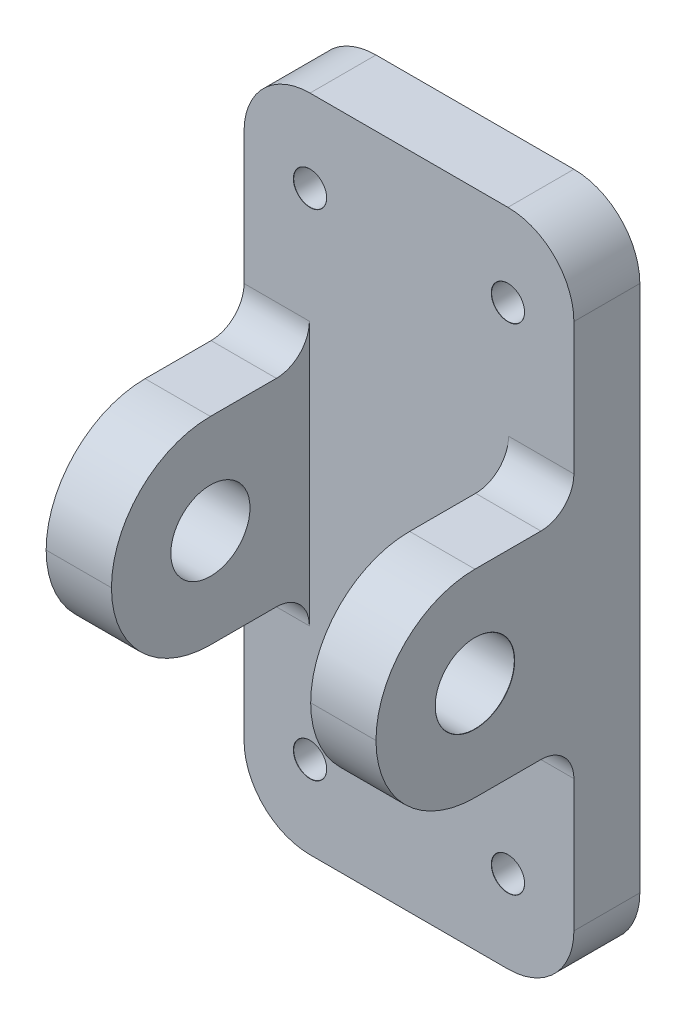
ISO-10303-21;
HEADER;
FILE_DESCRIPTION(('STEP AP214'),'2;1');
FILE_NAME('part.step','',(''),(''),'','','');
FILE_SCHEMA(('AUTOMOTIVE_DESIGN { 1 0 10303 214 1 1 1 1 }'));
ENDSEC;
DATA;
#1=APPLICATION_CONTEXT('core data for automotive mechanical design processes');
#2=APPLICATION_PROTOCOL_DEFINITION('international standard','automotive_design',2000,#1);
#3=PRODUCT_CONTEXT('',#1,'mechanical');
#4=PRODUCT('Part','Part','',(#3));
#5=PRODUCT_RELATED_PRODUCT_CATEGORY('part','',(#4));
#6=PRODUCT_DEFINITION_FORMATION('','',#4);
#7=PRODUCT_DEFINITION_CONTEXT('part definition',#1,'design');
#8=PRODUCT_DEFINITION('design','',#6,#7);
#9=PRODUCT_DEFINITION_SHAPE('','',#8);
#10=(LENGTH_UNIT() NAMED_UNIT(*) SI_UNIT(.MILLI.,.METRE.));
#11=(NAMED_UNIT(*) PLANE_ANGLE_UNIT() SI_UNIT($,.RADIAN.));
#12=(NAMED_UNIT(*) SI_UNIT($,.STERADIAN.) SOLID_ANGLE_UNIT());
#13=UNCERTAINTY_MEASURE_WITH_UNIT(LENGTH_MEASURE(1.E-05),#10,'distance_accuracy_value','');
#14=(GEOMETRIC_REPRESENTATION_CONTEXT(3) GLOBAL_UNCERTAINTY_ASSIGNED_CONTEXT((#13)) GLOBAL_UNIT_ASSIGNED_CONTEXT((#10,
#11,#12)) REPRESENTATION_CONTEXT('',''));
#15=CARTESIAN_POINT('',(0.,0.,0.));
#16=DIRECTION('',(0.,0.,1.));
#17=DIRECTION('',(1.,0.,0.));
#18=AXIS2_PLACEMENT_3D('',#15,#16,#17);
#19=CARTESIAN_POINT('',(0.,0.,0.));
#20=DIRECTION('',(0.,0.,1.));
#21=DIRECTION('',(1.,0.,0.));
#22=AXIS2_PLACEMENT_3D('',#19,#20,#21);
#23=PLANE('',#22);
#24=CARTESIAN_POINT('',(-15.,-37.5,0.));
#25=DIRECTION('',(0.,0.,1.));
#26=DIRECTION('',(1.,0.,0.));
#27=AXIS2_PLACEMENT_3D('',#24,#25,#26);
#28=CIRCLE('',#27,2.525);
#29=CARTESIAN_POINT('',(-12.475,-37.5,0.));
#30=VERTEX_POINT('',#29);
#31=EDGE_CURVE('E430',#30,#30,#28,.T.);
#32=ORIENTED_EDGE('',*,*,#31,.F.);
#33=EDGE_LOOP('',(#32));
#34=FACE_BOUND('',#33,.T.);
#35=CARTESIAN_POINT('',(15.,-37.5,0.));
#36=DIRECTION('',(0.,0.,1.));
#37=DIRECTION('',(1.,0.,0.));
#38=AXIS2_PLACEMENT_3D('',#35,#36,#37);
#39=CIRCLE('',#38,2.525);
#40=CARTESIAN_POINT('',(17.525,-37.5,0.));
#41=VERTEX_POINT('',#40);
#42=EDGE_CURVE('E419',#41,#41,#39,.T.);
#43=ORIENTED_EDGE('',*,*,#42,.F.);
#44=EDGE_LOOP('',(#43));
#45=FACE_BOUND('',#44,.T.);
#46=CARTESIAN_POINT('',(-15.,37.5,0.));
#47=DIRECTION('',(0.,0.,1.));
#48=DIRECTION('',(1.,0.,0.));
#49=AXIS2_PLACEMENT_3D('',#46,#47,#48);
#50=CIRCLE('',#49,2.525);
#51=CARTESIAN_POINT('',(-12.475,37.5,0.));
#52=VERTEX_POINT('',#51);
#53=EDGE_CURVE('E410',#52,#52,#50,.T.);
#54=ORIENTED_EDGE('',*,*,#53,.F.);
#55=EDGE_LOOP('',(#54));
#56=FACE_BOUND('',#55,.T.);
#57=CARTESIAN_POINT('',(15.,37.5,0.));
#58=DIRECTION('',(0.,0.,1.));
#59=DIRECTION('',(1.,0.,0.));
#60=AXIS2_PLACEMENT_3D('',#57,#58,#59);
#61=CIRCLE('',#60,2.525);
#62=CARTESIAN_POINT('',(17.525,37.5,0.));
#63=VERTEX_POINT('',#62);
#64=EDGE_CURVE('E398',#63,#63,#61,.T.);
#65=ORIENTED_EDGE('',*,*,#64,.F.);
#66=EDGE_LOOP('',(#65));
#67=FACE_BOUND('',#66,.T.);
#68=DIRECTION('',(-1.,0.,0.));
#69=VECTOR('',#68,1.);
#70=CARTESIAN_POINT('',(-25.,50.,0.));
#71=LINE('',#70,#69);
#72=CARTESIAN_POINT('',(15.,50.,0.));
#73=VERTEX_POINT('',#72);
#74=CARTESIAN_POINT('',(-15.,50.,0.));
#75=VERTEX_POINT('',#74);
#76=EDGE_CURVE('E355',#73,#75,#71,.T.);
#77=ORIENTED_EDGE('',*,*,#76,.T.);
#78=CARTESIAN_POINT('',(-15.,40.,0.));
#79=DIRECTION('',(0.,0.,1.));
#80=DIRECTION('',(1.,0.,0.));
#81=AXIS2_PLACEMENT_3D('',#78,#79,#80);
#82=CIRCLE('',#81,10.);
#83=CARTESIAN_POINT('',(-25.,40.,0.));
#84=VERTEX_POINT('',#83);
#85=EDGE_CURVE('E310',#75,#84,#82,.T.);
#86=ORIENTED_EDGE('',*,*,#85,.T.);
#87=DIRECTION('',(0.,-1.,0.));
#88=VECTOR('',#87,1.);
#89=CARTESIAN_POINT('',(-25.,-50.,0.));
#90=LINE('',#89,#88);
#91=CARTESIAN_POINT('',(-25.,20.,0.));
#92=VERTEX_POINT('',#91);
#93=EDGE_CURVE('E226',#84,#92,#90,.T.);
#94=ORIENTED_EDGE('',*,*,#93,.T.);
#95=DIRECTION('',(1.,0.,0.));
#96=VECTOR('',#95,1.);
#97=CARTESIAN_POINT('',(-15.1,20.,0.));
#98=LINE('',#97,#96);
#99=CARTESIAN_POINT('',(-15.1,20.,0.));
#100=VERTEX_POINT('',#99);
#101=EDGE_CURVE('E262',#92,#100,#98,.T.);
#102=ORIENTED_EDGE('',*,*,#101,.T.);
#103=DIRECTION('',(0.,1.,0.));
#104=VECTOR('',#103,1.);
#105=CARTESIAN_POINT('',(-15.1,0.,0.));
#106=LINE('',#105,#104);
#107=CARTESIAN_POINT('',(-15.1,-20.,0.));
#108=VERTEX_POINT('',#107);
#109=EDGE_CURVE('E366',#108,#100,#106,.T.);
#110=ORIENTED_EDGE('',*,*,#109,.F.);
#111=DIRECTION('',(1.,0.,0.));
#112=VECTOR('',#111,1.);
#113=CARTESIAN_POINT('',(0.,-20.,0.));
#114=LINE('',#113,#112);
#115=CARTESIAN_POINT('',(-25.,-20.,0.));
#116=VERTEX_POINT('',#115);
#117=EDGE_CURVE('E256',#108,#116,#114,.F.);
#118=ORIENTED_EDGE('',*,*,#117,.T.);
#119=CARTESIAN_POINT('',(-25.,-40.,0.));
#120=VERTEX_POINT('',#119);
#121=EDGE_CURVE('E347',#116,#120,#90,.T.);
#122=ORIENTED_EDGE('',*,*,#121,.T.);
#123=CARTESIAN_POINT('',(-15.,-40.,0.));
#124=DIRECTION('',(0.,0.,1.));
#125=DIRECTION('',(1.,0.,0.));
#126=AXIS2_PLACEMENT_3D('',#123,#124,#125);
#127=CIRCLE('',#126,10.);
#128=CARTESIAN_POINT('',(-15.,-50.,0.));
#129=VERTEX_POINT('',#128);
#130=EDGE_CURVE('E301',#120,#129,#127,.T.);
#131=ORIENTED_EDGE('',*,*,#130,.T.);
#132=DIRECTION('',(1.,0.,0.));
#133=VECTOR('',#132,1.);
#134=CARTESIAN_POINT('',(-25.,-50.,0.));
#135=LINE('',#134,#133);
#136=CARTESIAN_POINT('',(15.,-50.,0.));
#137=VERTEX_POINT('',#136);
#138=EDGE_CURVE('E334',#129,#137,#135,.T.);
#139=ORIENTED_EDGE('',*,*,#138,.T.);
#140=CARTESIAN_POINT('',(15.,-40.,0.));
#141=DIRECTION('',(0.,0.,1.));
#142=DIRECTION('',(1.,0.,0.));
#143=AXIS2_PLACEMENT_3D('',#140,#141,#142);
#144=CIRCLE('',#143,10.);
#145=CARTESIAN_POINT('',(25.,-40.,0.));
#146=VERTEX_POINT('',#145);
#147=EDGE_CURVE('E303',#137,#146,#144,.T.);
#148=ORIENTED_EDGE('',*,*,#147,.T.);
#149=DIRECTION('',(0.,1.,0.));
#150=VECTOR('',#149,1.);
#151=CARTESIAN_POINT('',(25.,-50.,0.));
#152=LINE('',#151,#150);
#153=CARTESIAN_POINT('',(25.,-20.,0.));
#154=VERTEX_POINT('',#153);
#155=EDGE_CURVE('E354',#146,#154,#152,.T.);
#156=ORIENTED_EDGE('',*,*,#155,.T.);
#157=DIRECTION('',(1.,0.,0.));
#158=VECTOR('',#157,1.);
#159=CARTESIAN_POINT('',(0.,-20.,0.));
#160=LINE('',#159,#158);
#161=CARTESIAN_POINT('',(15.1,-20.,0.));
#162=VERTEX_POINT('',#161);
#163=EDGE_CURVE('E250',#154,#162,#160,.F.);
#164=ORIENTED_EDGE('',*,*,#163,.T.);
#165=DIRECTION('',(0.,1.,0.));
#166=VECTOR('',#165,1.);
#167=CARTESIAN_POINT('',(15.1,0.,0.));
#168=LINE('',#167,#166);
#169=CARTESIAN_POINT('',(15.1,20.,0.));
#170=VERTEX_POINT('',#169);
#171=EDGE_CURVE('E216',#162,#170,#168,.T.);
#172=ORIENTED_EDGE('',*,*,#171,.T.);
#173=DIRECTION('',(1.,0.,0.));
#174=VECTOR('',#173,1.);
#175=CARTESIAN_POINT('',(25.,20.,0.));
#176=LINE('',#175,#174);
#177=CARTESIAN_POINT('',(25.,20.,0.));
#178=VERTEX_POINT('',#177);
#179=EDGE_CURVE('E265',#170,#178,#176,.T.);
#180=ORIENTED_EDGE('',*,*,#179,.T.);
#181=CARTESIAN_POINT('',(25.,40.,0.));
#182=VERTEX_POINT('',#181);
#183=EDGE_CURVE('E353',#178,#182,#152,.T.);
#184=ORIENTED_EDGE('',*,*,#183,.T.);
#185=CARTESIAN_POINT('',(15.,40.,0.));
#186=DIRECTION('',(0.,0.,1.));
#187=DIRECTION('',(1.,0.,0.));
#188=AXIS2_PLACEMENT_3D('',#185,#186,#187);
#189=CIRCLE('',#188,10.);
#190=EDGE_CURVE('E304',#182,#73,#189,.T.);
#191=ORIENTED_EDGE('',*,*,#190,.T.);
#192=EDGE_LOOP('',(#77,#86,#94,#102,#110,#118,#122,#131,#139,#148,#156,#164,#172,#180,#184,#191));
#193=FACE_BOUND('',#192,.T.);
#194=ADVANCED_FACE('F41',(#34,#45,#56,#67,#193),#23,.T.);
#195=CARTESIAN_POINT('',(-25.,-50.,-10.));
#196=DIRECTION('',(0.,-1.,0.));
#197=DIRECTION('',(0.,0.,-1.));
#198=AXIS2_PLACEMENT_3D('',#195,#196,#197);
#199=PLANE('',#198);
#200=DIRECTION('',(1.,0.,0.));
#201=VECTOR('',#200,1.);
#202=CARTESIAN_POINT('',(-25.,-50.,-10.));
#203=LINE('',#202,#201);
#204=CARTESIAN_POINT('',(-15.,-50.,-10.));
#205=VERTEX_POINT('',#204);
#206=CARTESIAN_POINT('',(15.,-50.,-10.));
#207=VERTEX_POINT('',#206);
#208=EDGE_CURVE('E330',#205,#207,#203,.T.);
#209=ORIENTED_EDGE('',*,*,#208,.T.);
#210=DIRECTION('',(0.,0.,1.));
#211=VECTOR('',#210,1.);
#212=CARTESIAN_POINT('',(15.,-50.,-10.));
#213=LINE('',#212,#211);
#214=EDGE_CURVE('E11',#207,#137,#213,.T.);
#215=ORIENTED_EDGE('',*,*,#214,.T.);
#216=ORIENTED_EDGE('',*,*,#138,.F.);
#217=DIRECTION('',(0.,0.,1.));
#218=VECTOR('',#217,1.);
#219=CARTESIAN_POINT('',(-15.,-50.,-10.));
#220=LINE('',#219,#218);
#221=EDGE_CURVE('E47',#129,#205,#220,.F.);
#222=ORIENTED_EDGE('',*,*,#221,.T.);
#223=EDGE_LOOP('',(#209,#215,#216,#222));
#224=FACE_BOUND('',#223,.T.);
#225=ADVANCED_FACE('F328',(#224),#199,.T.);
#226=CARTESIAN_POINT('',(-25.,-50.,-10.));
#227=DIRECTION('',(-1.,0.,0.));
#228=DIRECTION('',(0.,-1.,0.));
#229=AXIS2_PLACEMENT_3D('',#226,#227,#228);
#230=PLANE('',#229);
#231=CARTESIAN_POINT('',(-25.,0.,15.));
#232=DIRECTION('',(1.,0.,0.));
#233=DIRECTION('',(0.,0.,-1.));
#234=AXIS2_PLACEMENT_3D('',#231,#232,#233);
#235=CIRCLE('',#234,5.99999999999999);
#236=CARTESIAN_POINT('',(-25.,0.,9.00000000000001));
#237=VERTEX_POINT('',#236);
#238=EDGE_CURVE('E259',#237,#237,#235,.T.);
#239=ORIENTED_EDGE('',*,*,#238,.T.);
#240=EDGE_LOOP('',(#239));
#241=FACE_BOUND('',#240,.T.);
#242=ORIENTED_EDGE('',*,*,#93,.F.);
#243=DIRECTION('',(0.,0.,1.));
#244=VECTOR('',#243,1.);
#245=CARTESIAN_POINT('',(-25.,40.,-10.));
#246=LINE('',#245,#244);
#247=CARTESIAN_POINT('',(-25.,40.,-10.));
#248=VERTEX_POINT('',#247);
#249=EDGE_CURVE('E315',#84,#248,#246,.F.);
#250=ORIENTED_EDGE('',*,*,#249,.T.);
#251=DIRECTION('',(0.,-1.,0.));
#252=VECTOR('',#251,1.);
#253=CARTESIAN_POINT('',(-25.,-50.,-10.));
#254=LINE('',#253,#252);
#255=CARTESIAN_POINT('',(-25.,-40.,-10.));
#256=VERTEX_POINT('',#255);
#257=EDGE_CURVE('E222',#248,#256,#254,.T.);
#258=ORIENTED_EDGE('',*,*,#257,.T.);
#259=DIRECTION('',(0.,0.,1.));
#260=VECTOR('',#259,1.);
#261=CARTESIAN_POINT('',(-25.,-40.,-10.));
#262=LINE('',#261,#260);
#263=EDGE_CURVE('E307',#256,#120,#262,.T.);
#264=ORIENTED_EDGE('',*,*,#263,.T.);
#265=ORIENTED_EDGE('',*,*,#121,.F.);
#266=CARTESIAN_POINT('',(-25.,-20.,5.));
#267=DIRECTION('',(-1.,0.,0.));
#268=DIRECTION('',(0.,-1.,0.));
#269=AXIS2_PLACEMENT_3D('',#266,#267,#268);
#270=CIRCLE('',#269,5.);
#271=CARTESIAN_POINT('',(-25.,-15.,5.));
#272=VERTEX_POINT('',#271);
#273=EDGE_CURVE('E286',#116,#272,#270,.F.);
#274=ORIENTED_EDGE('',*,*,#273,.T.);
#275=DIRECTION('',(0.,0.,-1.));
#276=VECTOR('',#275,1.);
#277=CARTESIAN_POINT('',(-25.,-15.,30.));
#278=LINE('',#277,#276);
#279=CARTESIAN_POINT('',(-25.,-15.,15.));
#280=VERTEX_POINT('',#279);
#281=EDGE_CURVE('E379',#280,#272,#278,.T.);
#282=ORIENTED_EDGE('',*,*,#281,.F.);
#283=CARTESIAN_POINT('',(-25.,0.,15.));
#284=DIRECTION('',(-1.,0.,0.));
#285=DIRECTION('',(0.,-1.,0.));
#286=AXIS2_PLACEMENT_3D('',#283,#284,#285);
#287=CIRCLE('',#286,15.);
#288=CARTESIAN_POINT('',(-25.,0.,30.));
#289=VERTEX_POINT('',#288);
#290=EDGE_CURVE('E241',#280,#289,#287,.T.);
#291=ORIENTED_EDGE('',*,*,#290,.T.);
#292=CARTESIAN_POINT('',(-25.,0.,15.));
#293=DIRECTION('',(-1.,0.,0.));
#294=DIRECTION('',(0.,-1.,0.));
#295=AXIS2_PLACEMENT_3D('',#292,#293,#294);
#296=CIRCLE('',#295,15.);
#297=CARTESIAN_POINT('',(-25.,15.,15.));
#298=VERTEX_POINT('',#297);
#299=EDGE_CURVE('E243',#289,#298,#296,.T.);
#300=ORIENTED_EDGE('',*,*,#299,.T.);
#301=DIRECTION('',(0.,0.,-1.));
#302=VECTOR('',#301,1.);
#303=CARTESIAN_POINT('',(-25.,15.,30.));
#304=LINE('',#303,#302);
#305=CARTESIAN_POINT('',(-25.,15.,5.));
#306=VERTEX_POINT('',#305);
#307=EDGE_CURVE('E380',#298,#306,#304,.T.);
#308=ORIENTED_EDGE('',*,*,#307,.T.);
#309=CARTESIAN_POINT('',(-25.,20.,5.));
#310=DIRECTION('',(-1.,0.,0.));
#311=DIRECTION('',(0.,-1.,0.));
#312=AXIS2_PLACEMENT_3D('',#309,#310,#311);
#313=CIRCLE('',#312,5.);
#314=EDGE_CURVE('E284',#306,#92,#313,.F.);
#315=ORIENTED_EDGE('',*,*,#314,.T.);
#316=EDGE_LOOP('',(#242,#250,#258,#264,#265,#274,#282,#291,#300,#308,#315));
#317=FACE_BOUND('',#316,.T.);
#318=ADVANCED_FACE('F346',(#241,#317),#230,.T.);
#319=CARTESIAN_POINT('',(-25.,50.,-10.));
#320=DIRECTION('',(0.,1.,0.));
#321=DIRECTION('',(0.,0.,1.));
#322=AXIS2_PLACEMENT_3D('',#319,#320,#321);
#323=PLANE('',#322);
#324=DIRECTION('',(-1.,0.,0.));
#325=VECTOR('',#324,1.);
#326=CARTESIAN_POINT('',(-25.,50.,-10.));
#327=LINE('',#326,#325);
#328=CARTESIAN_POINT('',(15.,50.,-10.));
#329=VERTEX_POINT('',#328);
#330=CARTESIAN_POINT('',(-15.,50.,-10.));
#331=VERTEX_POINT('',#330);
#332=EDGE_CURVE('E223',#329,#331,#327,.T.);
#333=ORIENTED_EDGE('',*,*,#332,.T.);
#334=DIRECTION('',(0.,0.,1.));
#335=VECTOR('',#334,1.);
#336=CARTESIAN_POINT('',(-15.,50.,-10.));
#337=LINE('',#336,#335);
#338=EDGE_CURVE('E296',#331,#75,#337,.T.);
#339=ORIENTED_EDGE('',*,*,#338,.T.);
#340=ORIENTED_EDGE('',*,*,#76,.F.);
#341=DIRECTION('',(0.,0.,1.));
#342=VECTOR('',#341,1.);
#343=CARTESIAN_POINT('',(15.,50.,-10.));
#344=LINE('',#343,#342);
#345=EDGE_CURVE('E298',#73,#329,#344,.F.);
#346=ORIENTED_EDGE('',*,*,#345,.T.);
#347=EDGE_LOOP('',(#333,#339,#340,#346));
#348=FACE_BOUND('',#347,.T.);
#349=ADVANCED_FACE('F498',(#348),#323,.T.);
#350=CARTESIAN_POINT('',(25.,-50.,-10.));
#351=DIRECTION('',(1.,0.,0.));
#352=DIRECTION('',(0.,1.,0.));
#353=AXIS2_PLACEMENT_3D('',#350,#351,#352);
#354=PLANE('',#353);
#355=CARTESIAN_POINT('',(25.,0.,15.));
#356=DIRECTION('',(1.,0.,0.));
#357=DIRECTION('',(0.,0.,-1.));
#358=AXIS2_PLACEMENT_3D('',#355,#356,#357);
#359=CIRCLE('',#358,6.025);
#360=CARTESIAN_POINT('',(25.,0.,8.975));
#361=VERTEX_POINT('',#360);
#362=EDGE_CURVE('E391',#361,#361,#359,.T.);
#363=ORIENTED_EDGE('',*,*,#362,.F.);
#364=EDGE_LOOP('',(#363));
#365=FACE_BOUND('',#364,.T.);
#366=DIRECTION('',(0.,1.,0.));
#367=VECTOR('',#366,1.);
#368=CARTESIAN_POINT('',(25.,-50.,-10.));
#369=LINE('',#368,#367);
#370=CARTESIAN_POINT('',(25.,-40.,-10.));
#371=VERTEX_POINT('',#370);
#372=CARTESIAN_POINT('',(25.,40.,-10.));
#373=VERTEX_POINT('',#372);
#374=EDGE_CURVE('E339',#371,#373,#369,.T.);
#375=ORIENTED_EDGE('',*,*,#374,.T.);
#376=DIRECTION('',(0.,0.,1.));
#377=VECTOR('',#376,1.);
#378=CARTESIAN_POINT('',(25.,40.,-10.));
#379=LINE('',#378,#377);
#380=EDGE_CURVE('E324',#373,#182,#379,.T.);
#381=ORIENTED_EDGE('',*,*,#380,.T.);
#382=ORIENTED_EDGE('',*,*,#183,.F.);
#383=CARTESIAN_POINT('',(25.,20.,5.));
#384=DIRECTION('',(1.,0.,0.));
#385=DIRECTION('',(0.,1.,0.));
#386=AXIS2_PLACEMENT_3D('',#383,#384,#385);
#387=CIRCLE('',#386,5.);
#388=CARTESIAN_POINT('',(25.,15.,5.));
#389=VERTEX_POINT('',#388);
#390=EDGE_CURVE('E279',#178,#389,#387,.F.);
#391=ORIENTED_EDGE('',*,*,#390,.T.);
#392=DIRECTION('',(0.,0.,-1.));
#393=VECTOR('',#392,1.);
#394=CARTESIAN_POINT('',(25.,15.,30.));
#395=LINE('',#394,#393);
#396=CARTESIAN_POINT('',(25.,15.,15.));
#397=VERTEX_POINT('',#396);
#398=EDGE_CURVE('E211',#397,#389,#395,.T.);
#399=ORIENTED_EDGE('',*,*,#398,.F.);
#400=CARTESIAN_POINT('',(25.,0.,15.));
#401=DIRECTION('',(1.,0.,0.));
#402=DIRECTION('',(0.,1.,0.));
#403=AXIS2_PLACEMENT_3D('',#400,#401,#402);
#404=CIRCLE('',#403,15.);
#405=CARTESIAN_POINT('',(25.,0.,30.));
#406=VERTEX_POINT('',#405);
#407=EDGE_CURVE('E218',#397,#406,#404,.T.);
#408=ORIENTED_EDGE('',*,*,#407,.T.);
#409=CARTESIAN_POINT('',(25.,0.,15.));
#410=DIRECTION('',(1.,0.,0.));
#411=DIRECTION('',(0.,1.,0.));
#412=AXIS2_PLACEMENT_3D('',#409,#410,#411);
#413=CIRCLE('',#412,15.);
#414=CARTESIAN_POINT('',(25.,-15.,15.));
#415=VERTEX_POINT('',#414);
#416=EDGE_CURVE('E220',#406,#415,#413,.T.);
#417=ORIENTED_EDGE('',*,*,#416,.T.);
#418=DIRECTION('',(0.,0.,-1.));
#419=VECTOR('',#418,1.);
#420=CARTESIAN_POINT('',(25.,-15.,30.));
#421=LINE('',#420,#419);
#422=CARTESIAN_POINT('',(25.,-15.,5.));
#423=VERTEX_POINT('',#422);
#424=EDGE_CURVE('E370',#415,#423,#421,.T.);
#425=ORIENTED_EDGE('',*,*,#424,.T.);
#426=CARTESIAN_POINT('',(25.,-20.,5.));
#427=DIRECTION('',(1.,0.,0.));
#428=DIRECTION('',(0.,1.,0.));
#429=AXIS2_PLACEMENT_3D('',#426,#427,#428);
#430=CIRCLE('',#429,5.);
#431=EDGE_CURVE('E293',#423,#154,#430,.F.);
#432=ORIENTED_EDGE('',*,*,#431,.T.);
#433=ORIENTED_EDGE('',*,*,#155,.F.);
#434=DIRECTION('',(0.,0.,1.));
#435=VECTOR('',#434,1.);
#436=CARTESIAN_POINT('',(25.,-40.,-10.));
#437=LINE('',#436,#435);
#438=EDGE_CURVE('E62',#146,#371,#437,.F.);
#439=ORIENTED_EDGE('',*,*,#438,.T.);
#440=EDGE_LOOP('',(#375,#381,#382,#391,#399,#408,#417,#425,#432,#433,#439));
#441=FACE_BOUND('',#440,.T.);
#442=ADVANCED_FACE('F491',(#365,#441),#354,.T.);
#443=CARTESIAN_POINT('',(0.,0.,-10.));
#444=DIRECTION('',(0.,0.,1.));
#445=DIRECTION('',(1.,0.,0.));
#446=AXIS2_PLACEMENT_3D('',#443,#444,#445);
#447=PLANE('',#446);
#448=CARTESIAN_POINT('',(-15.,-37.5,-10.));
#449=DIRECTION('',(0.,0.,1.));
#450=DIRECTION('',(1.,0.,0.));
#451=AXIS2_PLACEMENT_3D('',#448,#449,#450);
#452=CIRCLE('',#451,2.5);
#453=CARTESIAN_POINT('',(-12.5,-37.5,-10.));
#454=VERTEX_POINT('',#453);
#455=EDGE_CURVE('E423',#454,#454,#452,.T.);
#456=ORIENTED_EDGE('',*,*,#455,.T.);
#457=EDGE_LOOP('',(#456));
#458=FACE_BOUND('',#457,.T.);
#459=CARTESIAN_POINT('',(15.,-37.5,-10.));
#460=DIRECTION('',(0.,0.,1.));
#461=DIRECTION('',(1.,0.,0.));
#462=AXIS2_PLACEMENT_3D('',#459,#460,#461);
#463=CIRCLE('',#462,2.5);
#464=CARTESIAN_POINT('',(17.5,-37.5,-10.));
#465=VERTEX_POINT('',#464);
#466=EDGE_CURVE('E412',#465,#465,#463,.T.);
#467=ORIENTED_EDGE('',*,*,#466,.T.);
#468=EDGE_LOOP('',(#467));
#469=FACE_BOUND('',#468,.T.);
#470=CARTESIAN_POINT('',(-15.,37.5,-10.));
#471=DIRECTION('',(0.,0.,1.));
#472=DIRECTION('',(1.,0.,0.));
#473=AXIS2_PLACEMENT_3D('',#470,#471,#472);
#474=CIRCLE('',#473,2.5);
#475=CARTESIAN_POINT('',(-12.5,37.5,-10.));
#476=VERTEX_POINT('',#475);
#477=EDGE_CURVE('E401',#476,#476,#474,.T.);
#478=ORIENTED_EDGE('',*,*,#477,.T.);
#479=EDGE_LOOP('',(#478));
#480=FACE_BOUND('',#479,.T.);
#481=CARTESIAN_POINT('',(15.,37.5,-10.));
#482=DIRECTION('',(0.,0.,1.));
#483=DIRECTION('',(1.,0.,0.));
#484=AXIS2_PLACEMENT_3D('',#481,#482,#483);
#485=CIRCLE('',#484,2.5);
#486=CARTESIAN_POINT('',(17.5,37.5,-10.));
#487=VERTEX_POINT('',#486);
#488=EDGE_CURVE('E393',#487,#487,#485,.T.);
#489=ORIENTED_EDGE('',*,*,#488,.T.);
#490=EDGE_LOOP('',(#489));
#491=FACE_BOUND('',#490,.T.);
#492=ORIENTED_EDGE('',*,*,#257,.F.);
#493=CARTESIAN_POINT('',(-15.,40.,-10.));
#494=DIRECTION('',(0.,0.,1.));
#495=DIRECTION('',(1.,0.,0.));
#496=AXIS2_PLACEMENT_3D('',#493,#494,#495);
#497=CIRCLE('',#496,10.);
#498=EDGE_CURVE('E316',#248,#331,#497,.F.);
#499=ORIENTED_EDGE('',*,*,#498,.T.);
#500=ORIENTED_EDGE('',*,*,#332,.F.);
#501=CARTESIAN_POINT('',(15.,40.,-10.));
#502=DIRECTION('',(0.,0.,1.));
#503=DIRECTION('',(1.,0.,0.));
#504=AXIS2_PLACEMENT_3D('',#501,#502,#503);
#505=CIRCLE('',#504,10.);
#506=EDGE_CURVE('E57',#329,#373,#505,.F.);
#507=ORIENTED_EDGE('',*,*,#506,.T.);
#508=ORIENTED_EDGE('',*,*,#374,.F.);
#509=CARTESIAN_POINT('',(15.,-40.,-10.));
#510=DIRECTION('',(0.,0.,1.));
#511=DIRECTION('',(1.,0.,0.));
#512=AXIS2_PLACEMENT_3D('',#509,#510,#511);
#513=CIRCLE('',#512,10.);
#514=EDGE_CURVE('E317',#371,#207,#513,.F.);
#515=ORIENTED_EDGE('',*,*,#514,.T.);
#516=ORIENTED_EDGE('',*,*,#208,.F.);
#517=CARTESIAN_POINT('',(-15.,-40.,-10.));
#518=DIRECTION('',(0.,0.,1.));
#519=DIRECTION('',(1.,0.,0.));
#520=AXIS2_PLACEMENT_3D('',#517,#518,#519);
#521=CIRCLE('',#520,10.);
#522=EDGE_CURVE('E313',#205,#256,#521,.F.);
#523=ORIENTED_EDGE('',*,*,#522,.T.);
#524=EDGE_LOOP('',(#492,#499,#500,#507,#508,#515,#516,#523));
#525=FACE_BOUND('',#524,.T.);
#526=ADVANCED_FACE('F340',(#458,#469,#480,#491,#525),#447,.F.);
#527=CARTESIAN_POINT('',(15.1,0.,30.));
#528=DIRECTION('',(-1.,0.,0.));
#529=DIRECTION('',(0.,-1.,0.));
#530=AXIS2_PLACEMENT_3D('',#527,#528,#529);
#531=PLANE('',#530);
#532=CARTESIAN_POINT('',(15.1,0.,15.));
#533=DIRECTION('',(-1.,0.,0.));
#534=DIRECTION('',(0.,-1.,0.));
#535=AXIS2_PLACEMENT_3D('',#532,#533,#534);
#536=CIRCLE('',#535,5.99999999999999);
#537=CARTESIAN_POINT('',(15.1,-5.99999999999998,15.));
#538=VERTEX_POINT('',#537);
#539=EDGE_CURVE('E251',#538,#538,#536,.T.);
#540=ORIENTED_EDGE('',*,*,#539,.F.);
#541=EDGE_LOOP('',(#540));
#542=FACE_BOUND('',#541,.T.);
#543=CARTESIAN_POINT('',(15.1,0.,15.));
#544=DIRECTION('',(-1.,0.,0.));
#545=DIRECTION('',(0.,-1.,0.));
#546=AXIS2_PLACEMENT_3D('',#543,#544,#545);
#547=CIRCLE('',#546,15.);
#548=CARTESIAN_POINT('',(15.1,-15.,15.));
#549=VERTEX_POINT('',#548);
#550=CARTESIAN_POINT('',(15.1,0.,30.));
#551=VERTEX_POINT('',#550);
#552=EDGE_CURVE('E200',#549,#551,#547,.T.);
#553=ORIENTED_EDGE('',*,*,#552,.T.);
#554=CARTESIAN_POINT('',(15.1,0.,15.));
#555=DIRECTION('',(-1.,0.,0.));
#556=DIRECTION('',(0.,-1.,0.));
#557=AXIS2_PLACEMENT_3D('',#554,#555,#556);
#558=CIRCLE('',#557,15.);
#559=CARTESIAN_POINT('',(15.1,15.,15.));
#560=VERTEX_POINT('',#559);
#561=EDGE_CURVE('E194',#551,#560,#558,.T.);
#562=ORIENTED_EDGE('',*,*,#561,.T.);
#563=DIRECTION('',(0.,0.,-1.));
#564=VECTOR('',#563,1.);
#565=CARTESIAN_POINT('',(15.1,15.,30.));
#566=LINE('',#565,#564);
#567=CARTESIAN_POINT('',(15.1,15.,5.));
#568=VERTEX_POINT('',#567);
#569=EDGE_CURVE('E196',#560,#568,#566,.T.);
#570=ORIENTED_EDGE('',*,*,#569,.T.);
#571=CARTESIAN_POINT('',(15.1,20.,5.));
#572=DIRECTION('',(-1.,0.,0.));
#573=DIRECTION('',(0.,-1.,0.));
#574=AXIS2_PLACEMENT_3D('',#571,#572,#573);
#575=CIRCLE('',#574,5.);
#576=EDGE_CURVE('E280',#568,#170,#575,.F.);
#577=ORIENTED_EDGE('',*,*,#576,.T.);
#578=ORIENTED_EDGE('',*,*,#171,.F.);
#579=CARTESIAN_POINT('',(15.1,-20.,5.));
#580=DIRECTION('',(-1.,0.,0.));
#581=DIRECTION('',(0.,-1.,0.));
#582=AXIS2_PLACEMENT_3D('',#579,#580,#581);
#583=CIRCLE('',#582,5.);
#584=CARTESIAN_POINT('',(15.1,-15.,5.));
#585=VERTEX_POINT('',#584);
#586=EDGE_CURVE('E295',#162,#585,#583,.F.);
#587=ORIENTED_EDGE('',*,*,#586,.T.);
#588=DIRECTION('',(0.,0.,-1.));
#589=VECTOR('',#588,1.);
#590=CARTESIAN_POINT('',(15.1,-15.,30.));
#591=LINE('',#590,#589);
#592=EDGE_CURVE('E361',#549,#585,#591,.T.);
#593=ORIENTED_EDGE('',*,*,#592,.F.);
#594=EDGE_LOOP('',(#553,#562,#570,#577,#578,#587,#593));
#595=FACE_BOUND('',#594,.T.);
#596=ADVANCED_FACE('F195',(#542,#595),#531,.T.);
#597=CARTESIAN_POINT('',(0.,-15.,30.));
#598=DIRECTION('',(0.,1.,0.));
#599=DIRECTION('',(-1.,0.,0.));
#600=AXIS2_PLACEMENT_3D('',#597,#598,#599);
#601=PLANE('',#600);
#602=ORIENTED_EDGE('',*,*,#592,.T.);
#603=DIRECTION('',(1.,0.,0.));
#604=VECTOR('',#603,1.);
#605=CARTESIAN_POINT('',(0.,-15.,5.));
#606=LINE('',#605,#604);
#607=EDGE_CURVE('E274',#585,#423,#606,.T.);
#608=ORIENTED_EDGE('',*,*,#607,.T.);
#609=ORIENTED_EDGE('',*,*,#424,.F.);
#610=DIRECTION('',(1.,0.,0.));
#611=VECTOR('',#610,1.);
#612=CARTESIAN_POINT('',(15.1,-15.,15.));
#613=LINE('',#612,#611);
#614=EDGE_CURVE('E203',#415,#549,#613,.F.);
#615=ORIENTED_EDGE('',*,*,#614,.T.);
#616=EDGE_LOOP('',(#602,#608,#609,#615));
#617=FACE_BOUND('',#616,.T.);
#618=ADVANCED_FACE('F483',(#617),#601,.F.);
#619=CARTESIAN_POINT('',(0.,15.,30.));
#620=DIRECTION('',(0.,1.,0.));
#621=DIRECTION('',(-1.,0.,0.));
#622=AXIS2_PLACEMENT_3D('',#619,#620,#621);
#623=PLANE('',#622);
#624=ORIENTED_EDGE('',*,*,#398,.T.);
#625=DIRECTION('',(1.,0.,0.));
#626=VECTOR('',#625,1.);
#627=CARTESIAN_POINT('',(15.1,15.,5.));
#628=LINE('',#627,#626);
#629=EDGE_CURVE('E215',#389,#568,#628,.F.);
#630=ORIENTED_EDGE('',*,*,#629,.T.);
#631=ORIENTED_EDGE('',*,*,#569,.F.);
#632=DIRECTION('',(1.,0.,0.));
#633=VECTOR('',#632,1.);
#634=CARTESIAN_POINT('',(0.,15.,15.));
#635=LINE('',#634,#633);
#636=EDGE_CURVE('E213',#560,#397,#635,.T.);
#637=ORIENTED_EDGE('',*,*,#636,.T.);
#638=EDGE_LOOP('',(#624,#630,#631,#637));
#639=FACE_BOUND('',#638,.T.);
#640=ADVANCED_FACE('F208',(#639),#623,.T.);
#641=CARTESIAN_POINT('',(0.,-15.,30.));
#642=DIRECTION('',(0.,1.,0.));
#643=DIRECTION('',(-1.,0.,0.));
#644=AXIS2_PLACEMENT_3D('',#641,#642,#643);
#645=PLANE('',#644);
#646=ORIENTED_EDGE('',*,*,#281,.T.);
#647=DIRECTION('',(1.,0.,0.));
#648=VECTOR('',#647,1.);
#649=CARTESIAN_POINT('',(0.,-15.,5.));
#650=LINE('',#649,#648);
#651=CARTESIAN_POINT('',(-15.1,-15.,5.));
#652=VERTEX_POINT('',#651);
#653=EDGE_CURVE('E272',#272,#652,#650,.T.);
#654=ORIENTED_EDGE('',*,*,#653,.T.);
#655=DIRECTION('',(0.,0.,-1.));
#656=VECTOR('',#655,1.);
#657=CARTESIAN_POINT('',(-15.1,-15.,30.));
#658=LINE('',#657,#656);
#659=CARTESIAN_POINT('',(-15.1,-15.,15.));
#660=VERTEX_POINT('',#659);
#661=EDGE_CURVE('E356',#660,#652,#658,.T.);
#662=ORIENTED_EDGE('',*,*,#661,.F.);
#663=DIRECTION('',(1.,0.,0.));
#664=VECTOR('',#663,1.);
#665=CARTESIAN_POINT('',(-25.,-15.,15.));
#666=LINE('',#665,#664);
#667=EDGE_CURVE('E244',#660,#280,#666,.F.);
#668=ORIENTED_EDGE('',*,*,#667,.T.);
#669=EDGE_LOOP('',(#646,#654,#662,#668));
#670=FACE_BOUND('',#669,.T.);
#671=ADVANCED_FACE('F479',(#670),#645,.F.);
#672=CARTESIAN_POINT('',(-15.1,0.,30.));
#673=DIRECTION('',(-1.,0.,0.));
#674=DIRECTION('',(0.,-1.,0.));
#675=AXIS2_PLACEMENT_3D('',#672,#673,#674);
#676=PLANE('',#675);
#677=CARTESIAN_POINT('',(-15.1,0.,15.));
#678=DIRECTION('',(-1.,0.,0.));
#679=DIRECTION('',(0.,-1.,0.));
#680=AXIS2_PLACEMENT_3D('',#677,#678,#679);
#681=CIRCLE('',#680,5.99999999999999);
#682=CARTESIAN_POINT('',(-15.1,-5.99999999999998,15.));
#683=VERTEX_POINT('',#682);
#684=EDGE_CURVE('E254',#683,#683,#681,.T.);
#685=ORIENTED_EDGE('',*,*,#684,.T.);
#686=EDGE_LOOP('',(#685));
#687=FACE_BOUND('',#686,.T.);
#688=DIRECTION('',(0.,0.,-1.));
#689=VECTOR('',#688,1.);
#690=CARTESIAN_POINT('',(-15.1,15.,30.));
#691=LINE('',#690,#689);
#692=CARTESIAN_POINT('',(-15.1,15.,15.));
#693=VERTEX_POINT('',#692);
#694=CARTESIAN_POINT('',(-15.1,15.,5.));
#695=VERTEX_POINT('',#694);
#696=EDGE_CURVE('E372',#693,#695,#691,.T.);
#697=ORIENTED_EDGE('',*,*,#696,.F.);
#698=CARTESIAN_POINT('',(-15.1,0.,15.));
#699=DIRECTION('',(-1.,0.,0.));
#700=DIRECTION('',(0.,-1.,0.));
#701=AXIS2_PLACEMENT_3D('',#698,#699,#700);
#702=CIRCLE('',#701,15.);
#703=CARTESIAN_POINT('',(-15.1,0.,30.));
#704=VERTEX_POINT('',#703);
#705=EDGE_CURVE('E237',#693,#704,#702,.F.);
#706=ORIENTED_EDGE('',*,*,#705,.T.);
#707=CARTESIAN_POINT('',(-15.1,0.,15.));
#708=DIRECTION('',(-1.,0.,0.));
#709=DIRECTION('',(0.,-1.,0.));
#710=AXIS2_PLACEMENT_3D('',#707,#708,#709);
#711=CIRCLE('',#710,15.);
#712=EDGE_CURVE('E240',#704,#660,#711,.F.);
#713=ORIENTED_EDGE('',*,*,#712,.T.);
#714=ORIENTED_EDGE('',*,*,#661,.T.);
#715=CARTESIAN_POINT('',(-15.1,-20.,5.));
#716=DIRECTION('',(-1.,0.,0.));
#717=DIRECTION('',(0.,-1.,0.));
#718=AXIS2_PLACEMENT_3D('',#715,#716,#717);
#719=CIRCLE('',#718,5.);
#720=EDGE_CURVE('E287',#652,#108,#719,.T.);
#721=ORIENTED_EDGE('',*,*,#720,.T.);
#722=ORIENTED_EDGE('',*,*,#109,.T.);
#723=CARTESIAN_POINT('',(-15.1,20.,5.));
#724=DIRECTION('',(-1.,0.,0.));
#725=DIRECTION('',(0.,-1.,0.));
#726=AXIS2_PLACEMENT_3D('',#723,#724,#725);
#727=CIRCLE('',#726,5.);
#728=EDGE_CURVE('E281',#100,#695,#727,.T.);
#729=ORIENTED_EDGE('',*,*,#728,.T.);
#730=EDGE_LOOP('',(#697,#706,#713,#714,#721,#722,#729));
#731=FACE_BOUND('',#730,.T.);
#732=ADVANCED_FACE('F475',(#687,#731),#676,.F.);
#733=CARTESIAN_POINT('',(0.,15.,30.));
#734=DIRECTION('',(0.,1.,0.));
#735=DIRECTION('',(-1.,0.,0.));
#736=AXIS2_PLACEMENT_3D('',#733,#734,#735);
#737=PLANE('',#736);
#738=ORIENTED_EDGE('',*,*,#696,.T.);
#739=DIRECTION('',(1.,0.,0.));
#740=VECTOR('',#739,1.);
#741=CARTESIAN_POINT('',(-25.,15.,5.));
#742=LINE('',#741,#740);
#743=EDGE_CURVE('E266',#695,#306,#742,.F.);
#744=ORIENTED_EDGE('',*,*,#743,.T.);
#745=ORIENTED_EDGE('',*,*,#307,.F.);
#746=DIRECTION('',(1.,0.,0.));
#747=VECTOR('',#746,1.);
#748=CARTESIAN_POINT('',(0.,15.,15.));
#749=LINE('',#748,#747);
#750=EDGE_CURVE('E234',#298,#693,#749,.T.);
#751=ORIENTED_EDGE('',*,*,#750,.T.);
#752=EDGE_LOOP('',(#738,#744,#745,#751));
#753=FACE_BOUND('',#752,.T.);
#754=ADVANCED_FACE('F468',(#753),#737,.T.);
#755=CARTESIAN_POINT('',(0.,0.,15.));
#756=DIRECTION('',(-1.,0.,0.));
#757=DIRECTION('',(0.,-1.,0.));
#758=AXIS2_PLACEMENT_3D('',#755,#756,#757);
#759=CYLINDRICAL_SURFACE('',#758,15.);
#760=DIRECTION('',(1.,0.,0.));
#761=VECTOR('',#760,1.);
#762=CARTESIAN_POINT('',(25.,0.,30.));
#763=LINE('',#762,#761);
#764=EDGE_CURVE('E247',#551,#406,#763,.T.);
#765=ORIENTED_EDGE('',*,*,#764,.F.);
#766=ORIENTED_EDGE('',*,*,#552,.F.);
#767=ORIENTED_EDGE('',*,*,#614,.F.);
#768=ORIENTED_EDGE('',*,*,#416,.F.);
#769=EDGE_LOOP('',(#765,#766,#767,#768));
#770=FACE_BOUND('',#769,.T.);
#771=ADVANCED_FACE('F472',(#770),#759,.T.);
#772=CARTESIAN_POINT('',(0.,0.,15.));
#773=DIRECTION('',(1.,0.,0.));
#774=DIRECTION('',(0.,1.,0.));
#775=AXIS2_PLACEMENT_3D('',#772,#773,#774);
#776=CYLINDRICAL_SURFACE('',#775,15.);
#777=ORIENTED_EDGE('',*,*,#561,.F.);
#778=ORIENTED_EDGE('',*,*,#764,.T.);
#779=ORIENTED_EDGE('',*,*,#407,.F.);
#780=ORIENTED_EDGE('',*,*,#636,.F.);
#781=EDGE_LOOP('',(#777,#778,#779,#780));
#782=FACE_BOUND('',#781,.T.);
#783=ADVANCED_FACE('F219',(#782),#776,.T.);
#784=CARTESIAN_POINT('',(0.,0.,15.));
#785=DIRECTION('',(-1.,0.,0.));
#786=DIRECTION('',(0.,-1.,0.));
#787=AXIS2_PLACEMENT_3D('',#784,#785,#786);
#788=CYLINDRICAL_SURFACE('',#787,15.);
#789=DIRECTION('',(1.,0.,0.));
#790=VECTOR('',#789,1.);
#791=CARTESIAN_POINT('',(-15.1,0.,30.));
#792=LINE('',#791,#790);
#793=EDGE_CURVE('E249',#289,#704,#792,.T.);
#794=ORIENTED_EDGE('',*,*,#793,.F.);
#795=ORIENTED_EDGE('',*,*,#290,.F.);
#796=ORIENTED_EDGE('',*,*,#667,.F.);
#797=ORIENTED_EDGE('',*,*,#712,.F.);
#798=EDGE_LOOP('',(#794,#795,#796,#797));
#799=FACE_BOUND('',#798,.T.);
#800=ADVANCED_FACE('F509',(#799),#788,.T.);
#801=CARTESIAN_POINT('',(0.,0.,15.));
#802=DIRECTION('',(1.,0.,0.));
#803=DIRECTION('',(0.,1.,0.));
#804=AXIS2_PLACEMENT_3D('',#801,#802,#803);
#805=CYLINDRICAL_SURFACE('',#804,15.);
#806=ORIENTED_EDGE('',*,*,#299,.F.);
#807=ORIENTED_EDGE('',*,*,#793,.T.);
#808=ORIENTED_EDGE('',*,*,#705,.F.);
#809=ORIENTED_EDGE('',*,*,#750,.F.);
#810=EDGE_LOOP('',(#806,#807,#808,#809));
#811=FACE_BOUND('',#810,.T.);
#812=ADVANCED_FACE('F466',(#811),#805,.T.);
#813=CARTESIAN_POINT('',(25.,0.,15.));
#814=DIRECTION('',(1.,0.,0.));
#815=DIRECTION('',(0.,0.,-1.));
#816=AXIS2_PLACEMENT_3D('',#813,#814,#815);
#817=CYLINDRICAL_SURFACE('',#816,5.99999999999999);
#818=ORIENTED_EDGE('',*,*,#539,.T.);
#819=EDGE_LOOP('',(#818));
#820=FACE_BOUND('',#819,.T.);
#821=CARTESIAN_POINT('',(24.975,0.,15.));
#822=DIRECTION('',(1.,0.,0.));
#823=DIRECTION('',(0.,0.,-1.));
#824=AXIS2_PLACEMENT_3D('',#821,#822,#823);
#825=CIRCLE('',#824,5.99999999999999);
#826=CARTESIAN_POINT('',(24.975,0.,9.00000000000001));
#827=VERTEX_POINT('',#826);
#828=EDGE_CURVE('E387',#827,#827,#825,.T.);
#829=ORIENTED_EDGE('',*,*,#828,.T.);
#830=EDGE_LOOP('',(#829));
#831=FACE_BOUND('',#830,.T.);
#832=ADVANCED_FACE('F461',(#820,#831),#817,.F.);
#833=CARTESIAN_POINT('',(25.,0.,15.));
#834=DIRECTION('',(1.,0.,0.));
#835=DIRECTION('',(0.,0.,-1.));
#836=AXIS2_PLACEMENT_3D('',#833,#834,#835);
#837=CONICAL_SURFACE('',#836,6.025,0.785398163397362);
#838=ORIENTED_EDGE('',*,*,#828,.F.);
#839=EDGE_LOOP('',(#838));
#840=FACE_BOUND('',#839,.T.);
#841=ORIENTED_EDGE('',*,*,#362,.T.);
#842=EDGE_LOOP('',(#841));
#843=FACE_BOUND('',#842,.T.);
#844=ADVANCED_FACE('F462',(#840,#843),#837,.F.);
#845=ORIENTED_EDGE('',*,*,#238,.F.);
#846=EDGE_LOOP('',(#845));
#847=FACE_BOUND('',#846,.T.);
#848=ORIENTED_EDGE('',*,*,#684,.F.);
#849=EDGE_LOOP('',(#848));
#850=FACE_BOUND('',#849,.T.);
#851=ADVANCED_FACE('F451',(#847,#850),#817,.F.);
#852=CARTESIAN_POINT('',(15.,37.5,0.));
#853=DIRECTION('',(0.,0.,1.));
#854=DIRECTION('',(1.,0.,0.));
#855=AXIS2_PLACEMENT_3D('',#852,#853,#854);
#856=CYLINDRICAL_SURFACE('',#855,2.5);
#857=ORIENTED_EDGE('',*,*,#488,.F.);
#858=EDGE_LOOP('',(#857));
#859=FACE_BOUND('',#858,.T.);
#860=CARTESIAN_POINT('',(15.,37.5,-0.024999999999999));
#861=DIRECTION('',(0.,0.,1.));
#862=DIRECTION('',(1.,0.,0.));
#863=AXIS2_PLACEMENT_3D('',#860,#861,#862);
#864=CIRCLE('',#863,2.5);
#865=CARTESIAN_POINT('',(17.5,37.5,-0.024999999999999));
#866=VERTEX_POINT('',#865);
#867=EDGE_CURVE('E400',#866,#866,#864,.T.);
#868=ORIENTED_EDGE('',*,*,#867,.T.);
#869=EDGE_LOOP('',(#868));
#870=FACE_BOUND('',#869,.T.);
#871=ADVANCED_FACE('F444',(#859,#870),#856,.F.);
#872=CARTESIAN_POINT('',(15.,37.5,0.));
#873=DIRECTION('',(0.,0.,1.));
#874=DIRECTION('',(1.,0.,0.));
#875=AXIS2_PLACEMENT_3D('',#872,#873,#874);
#876=CONICAL_SURFACE('',#875,2.525,0.785398163397483);
#877=ORIENTED_EDGE('',*,*,#867,.F.);
#878=EDGE_LOOP('',(#877));
#879=FACE_BOUND('',#878,.T.);
#880=ORIENTED_EDGE('',*,*,#64,.T.);
#881=EDGE_LOOP('',(#880));
#882=FACE_BOUND('',#881,.T.);
#883=ADVANCED_FACE('F445',(#879,#882),#876,.F.);
#884=CARTESIAN_POINT('',(-15.,37.5,0.));
#885=DIRECTION('',(0.,0.,1.));
#886=DIRECTION('',(1.,0.,0.));
#887=AXIS2_PLACEMENT_3D('',#884,#885,#886);
#888=CYLINDRICAL_SURFACE('',#887,2.5);
#889=ORIENTED_EDGE('',*,*,#477,.F.);
#890=EDGE_LOOP('',(#889));
#891=FACE_BOUND('',#890,.T.);
#892=CARTESIAN_POINT('',(-15.,37.5,-0.024999999999999));
#893=DIRECTION('',(0.,0.,1.));
#894=DIRECTION('',(1.,0.,0.));
#895=AXIS2_PLACEMENT_3D('',#892,#893,#894);
#896=CIRCLE('',#895,2.5);
#897=CARTESIAN_POINT('',(-12.5,37.5,-0.024999999999999));
#898=VERTEX_POINT('',#897);
#899=EDGE_CURVE('E408',#898,#898,#896,.T.);
#900=ORIENTED_EDGE('',*,*,#899,.T.);
#901=EDGE_LOOP('',(#900));
#902=FACE_BOUND('',#901,.T.);
#903=ADVANCED_FACE('F443',(#891,#902),#888,.F.);
#904=CARTESIAN_POINT('',(-15.,37.5,0.));
#905=DIRECTION('',(0.,0.,1.));
#906=DIRECTION('',(1.,0.,0.));
#907=AXIS2_PLACEMENT_3D('',#904,#905,#906);
#908=CONICAL_SURFACE('',#907,2.525,0.785398163397483);
#909=ORIENTED_EDGE('',*,*,#899,.F.);
#910=EDGE_LOOP('',(#909));
#911=FACE_BOUND('',#910,.T.);
#912=ORIENTED_EDGE('',*,*,#53,.T.);
#913=EDGE_LOOP('',(#912));
#914=FACE_BOUND('',#913,.T.);
#915=ADVANCED_FACE('F454',(#911,#914),#908,.F.);
#916=CARTESIAN_POINT('',(15.,-37.5,0.));
#917=DIRECTION('',(0.,0.,1.));
#918=DIRECTION('',(1.,0.,0.));
#919=AXIS2_PLACEMENT_3D('',#916,#917,#918);
#920=CYLINDRICAL_SURFACE('',#919,2.5);
#921=ORIENTED_EDGE('',*,*,#466,.F.);
#922=EDGE_LOOP('',(#921));
#923=FACE_BOUND('',#922,.T.);
#924=CARTESIAN_POINT('',(15.,-37.5,-0.024999999999999));
#925=DIRECTION('',(0.,0.,1.));
#926=DIRECTION('',(1.,0.,0.));
#927=AXIS2_PLACEMENT_3D('',#924,#925,#926);
#928=CIRCLE('',#927,2.5);
#929=CARTESIAN_POINT('',(17.5,-37.5,-0.024999999999999));
#930=VERTEX_POINT('',#929);
#931=EDGE_CURVE('E415',#930,#930,#928,.T.);
#932=ORIENTED_EDGE('',*,*,#931,.T.);
#933=EDGE_LOOP('',(#932));
#934=FACE_BOUND('',#933,.T.);
#935=ADVANCED_FACE('F651',(#923,#934),#920,.F.);
#936=CARTESIAN_POINT('',(15.,-37.5,0.));
#937=DIRECTION('',(0.,0.,1.));
#938=DIRECTION('',(1.,0.,0.));
#939=AXIS2_PLACEMENT_3D('',#936,#937,#938);
#940=CONICAL_SURFACE('',#939,2.525,0.785398163397483);
#941=ORIENTED_EDGE('',*,*,#931,.F.);
#942=EDGE_LOOP('',(#941));
#943=FACE_BOUND('',#942,.T.);
#944=ORIENTED_EDGE('',*,*,#42,.T.);
#945=EDGE_LOOP('',(#944));
#946=FACE_BOUND('',#945,.T.);
#947=ADVANCED_FACE('F642',(#943,#946),#940,.F.);
#948=CARTESIAN_POINT('',(-15.,-37.5,0.));
#949=DIRECTION('',(0.,0.,1.));
#950=DIRECTION('',(1.,0.,0.));
#951=AXIS2_PLACEMENT_3D('',#948,#949,#950);
#952=CYLINDRICAL_SURFACE('',#951,2.5);
#953=ORIENTED_EDGE('',*,*,#455,.F.);
#954=EDGE_LOOP('',(#953));
#955=FACE_BOUND('',#954,.T.);
#956=CARTESIAN_POINT('',(-15.,-37.5,-0.024999999999999));
#957=DIRECTION('',(0.,0.,1.));
#958=DIRECTION('',(1.,0.,0.));
#959=AXIS2_PLACEMENT_3D('',#956,#957,#958);
#960=CIRCLE('',#959,2.5);
#961=CARTESIAN_POINT('',(-12.5,-37.5,-0.024999999999999));
#962=VERTEX_POINT('',#961);
#963=EDGE_CURVE('E425',#962,#962,#960,.T.);
#964=ORIENTED_EDGE('',*,*,#963,.T.);
#965=EDGE_LOOP('',(#964));
#966=FACE_BOUND('',#965,.T.);
#967=ADVANCED_FACE('F631',(#955,#966),#952,.F.);
#968=CARTESIAN_POINT('',(-15.,-37.5,0.));
#969=DIRECTION('',(0.,0.,1.));
#970=DIRECTION('',(1.,0.,0.));
#971=AXIS2_PLACEMENT_3D('',#968,#969,#970);
#972=CONICAL_SURFACE('',#971,2.525,0.785398163397483);
#973=ORIENTED_EDGE('',*,*,#963,.F.);
#974=EDGE_LOOP('',(#973));
#975=FACE_BOUND('',#974,.T.);
#976=ORIENTED_EDGE('',*,*,#31,.T.);
#977=EDGE_LOOP('',(#976));
#978=FACE_BOUND('',#977,.T.);
#979=ADVANCED_FACE('F431',(#975,#978),#972,.F.);
#980=CARTESIAN_POINT('',(0.,20.,5.));
#981=DIRECTION('',(-1.,0.,0.));
#982=DIRECTION('',(0.,-1.,0.));
#983=AXIS2_PLACEMENT_3D('',#980,#981,#982);
#984=CYLINDRICAL_SURFACE('',#983,5.);
#985=ORIENTED_EDGE('',*,*,#576,.F.);
#986=ORIENTED_EDGE('',*,*,#629,.F.);
#987=ORIENTED_EDGE('',*,*,#390,.F.);
#988=ORIENTED_EDGE('',*,*,#179,.F.);
#989=EDGE_LOOP('',(#985,#986,#987,#988));
#990=FACE_BOUND('',#989,.T.);
#991=ADVANCED_FACE('F516',(#990),#984,.F.);
#992=CARTESIAN_POINT('',(0.,20.,5.));
#993=DIRECTION('',(-1.,0.,0.));
#994=DIRECTION('',(0.,-1.,0.));
#995=AXIS2_PLACEMENT_3D('',#992,#993,#994);
#996=CYLINDRICAL_SURFACE('',#995,5.);
#997=ORIENTED_EDGE('',*,*,#314,.F.);
#998=ORIENTED_EDGE('',*,*,#743,.F.);
#999=ORIENTED_EDGE('',*,*,#728,.F.);
#1000=ORIENTED_EDGE('',*,*,#101,.F.);
#1001=EDGE_LOOP('',(#997,#998,#999,#1000));
#1002=FACE_BOUND('',#1001,.T.);
#1003=ADVANCED_FACE('F524',(#1002),#996,.F.);
#1004=CARTESIAN_POINT('',(0.,-20.,5.));
#1005=DIRECTION('',(1.,0.,0.));
#1006=DIRECTION('',(0.,1.,0.));
#1007=AXIS2_PLACEMENT_3D('',#1004,#1005,#1006);
#1008=CYLINDRICAL_SURFACE('',#1007,5.);
#1009=ORIENTED_EDGE('',*,*,#273,.F.);
#1010=ORIENTED_EDGE('',*,*,#117,.F.);
#1011=ORIENTED_EDGE('',*,*,#720,.F.);
#1012=ORIENTED_EDGE('',*,*,#653,.F.);
#1013=EDGE_LOOP('',(#1009,#1010,#1011,#1012));
#1014=FACE_BOUND('',#1013,.T.);
#1015=ADVANCED_FACE('F530',(#1014),#1008,.F.);
#1016=CARTESIAN_POINT('',(0.,-20.,5.));
#1017=DIRECTION('',(1.,0.,0.));
#1018=DIRECTION('',(0.,1.,0.));
#1019=AXIS2_PLACEMENT_3D('',#1016,#1017,#1018);
#1020=CYLINDRICAL_SURFACE('',#1019,5.);
#1021=ORIENTED_EDGE('',*,*,#586,.F.);
#1022=ORIENTED_EDGE('',*,*,#163,.F.);
#1023=ORIENTED_EDGE('',*,*,#431,.F.);
#1024=ORIENTED_EDGE('',*,*,#607,.F.);
#1025=EDGE_LOOP('',(#1021,#1022,#1023,#1024));
#1026=FACE_BOUND('',#1025,.T.);
#1027=ADVANCED_FACE('F532',(#1026),#1020,.F.);
#1028=CARTESIAN_POINT('',(-15.,40.,-10.));
#1029=DIRECTION('',(0.,0.,1.));
#1030=DIRECTION('',(1.,0.,0.));
#1031=AXIS2_PLACEMENT_3D('',#1028,#1029,#1030);
#1032=CYLINDRICAL_SURFACE('',#1031,10.);
#1033=ORIENTED_EDGE('',*,*,#498,.F.);
#1034=ORIENTED_EDGE('',*,*,#249,.F.);
#1035=ORIENTED_EDGE('',*,*,#85,.F.);
#1036=ORIENTED_EDGE('',*,*,#338,.F.);
#1037=EDGE_LOOP('',(#1033,#1034,#1035,#1036));
#1038=FACE_BOUND('',#1037,.T.);
#1039=ADVANCED_FACE('F533',(#1038),#1032,.T.);
#1040=CARTESIAN_POINT('',(15.,40.,-10.));
#1041=DIRECTION('',(0.,0.,1.));
#1042=DIRECTION('',(1.,0.,0.));
#1043=AXIS2_PLACEMENT_3D('',#1040,#1041,#1042);
#1044=CYLINDRICAL_SURFACE('',#1043,10.);
#1045=ORIENTED_EDGE('',*,*,#506,.F.);
#1046=ORIENTED_EDGE('',*,*,#345,.F.);
#1047=ORIENTED_EDGE('',*,*,#190,.F.);
#1048=ORIENTED_EDGE('',*,*,#380,.F.);
#1049=EDGE_LOOP('',(#1045,#1046,#1047,#1048));
#1050=FACE_BOUND('',#1049,.T.);
#1051=ADVANCED_FACE('F540',(#1050),#1044,.T.);
#1052=CARTESIAN_POINT('',(15.,-40.,-10.));
#1053=DIRECTION('',(0.,0.,1.));
#1054=DIRECTION('',(1.,0.,0.));
#1055=AXIS2_PLACEMENT_3D('',#1052,#1053,#1054);
#1056=CYLINDRICAL_SURFACE('',#1055,10.);
#1057=ORIENTED_EDGE('',*,*,#514,.F.);
#1058=ORIENTED_EDGE('',*,*,#438,.F.);
#1059=ORIENTED_EDGE('',*,*,#147,.F.);
#1060=ORIENTED_EDGE('',*,*,#214,.F.);
#1061=EDGE_LOOP('',(#1057,#1058,#1059,#1060));
#1062=FACE_BOUND('',#1061,.T.);
#1063=ADVANCED_FACE('F542',(#1062),#1056,.T.);
#1064=CARTESIAN_POINT('',(-15.,-40.,-10.));
#1065=DIRECTION('',(0.,0.,1.));
#1066=DIRECTION('',(1.,0.,0.));
#1067=AXIS2_PLACEMENT_3D('',#1064,#1065,#1066);
#1068=CYLINDRICAL_SURFACE('',#1067,10.);
#1069=ORIENTED_EDGE('',*,*,#522,.F.);
#1070=ORIENTED_EDGE('',*,*,#221,.F.);
#1071=ORIENTED_EDGE('',*,*,#130,.F.);
#1072=ORIENTED_EDGE('',*,*,#263,.F.);
#1073=EDGE_LOOP('',(#1069,#1070,#1071,#1072));
#1074=FACE_BOUND('',#1073,.T.);
#1075=ADVANCED_FACE('F43',(#1074),#1068,.T.);
#1076=CLOSED_SHELL('',(#194,#225,#318,#349,#442,#526,#596,#618,#640,#671,#732,#754,#771,#783,
#800,#812,#832,#844,#851,#871,#883,#903,#915,#935,#947,#967,#979,#991,#1003,#1015,#1027,#1039,
#1051,#1063,#1075));
#1077=MANIFOLD_SOLID_BREP('B2',#1076);
#1078=ADVANCED_BREP_SHAPE_REPRESENTATION('',(#18,#1077),#14);
#1079=SHAPE_DEFINITION_REPRESENTATION(#9,#1078);
ENDSEC;
END-ISO-10303-21;
